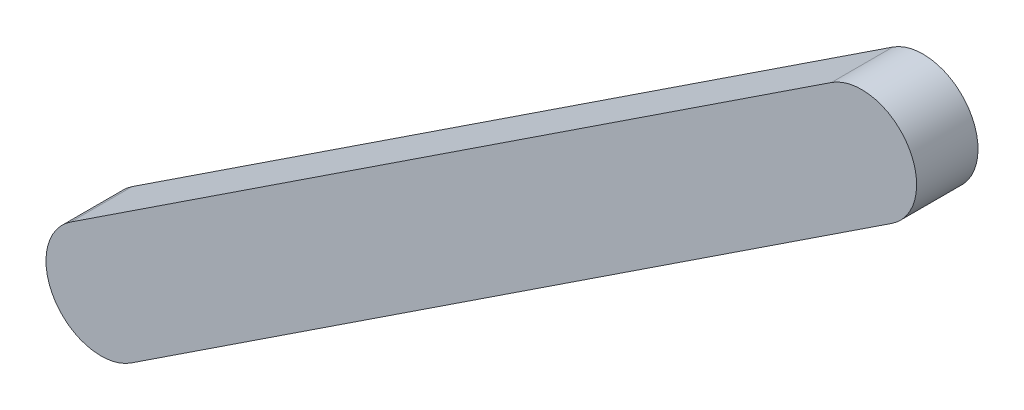
ISO-10303-21;
HEADER;
FILE_DESCRIPTION(('STEP AP214'),'2;1');
FILE_NAME('part.step','',(''),(''),'','','');
FILE_SCHEMA(('AUTOMOTIVE_DESIGN { 1 0 10303 214 1 1 1 1 }'));
ENDSEC;
DATA;
#1=APPLICATION_CONTEXT('core data for automotive mechanical design processes');
#2=APPLICATION_PROTOCOL_DEFINITION('international standard','automotive_design',2000,#1);
#3=PRODUCT_CONTEXT('',#1,'mechanical');
#4=PRODUCT('Part','Part','',(#3));
#5=PRODUCT_RELATED_PRODUCT_CATEGORY('part','',(#4));
#6=PRODUCT_DEFINITION_FORMATION('','',#4);
#7=PRODUCT_DEFINITION_CONTEXT('part definition',#1,'design');
#8=PRODUCT_DEFINITION('design','',#6,#7);
#9=PRODUCT_DEFINITION_SHAPE('','',#8);
#10=(LENGTH_UNIT() NAMED_UNIT(*) SI_UNIT(.MILLI.,.METRE.));
#11=(NAMED_UNIT(*) PLANE_ANGLE_UNIT() SI_UNIT($,.RADIAN.));
#12=(NAMED_UNIT(*) SI_UNIT($,.STERADIAN.) SOLID_ANGLE_UNIT());
#13=UNCERTAINTY_MEASURE_WITH_UNIT(LENGTH_MEASURE(1.E-05),#10,'distance_accuracy_value','');
#14=(GEOMETRIC_REPRESENTATION_CONTEXT(3) GLOBAL_UNCERTAINTY_ASSIGNED_CONTEXT((#13)) GLOBAL_UNIT_ASSIGNED_CONTEXT((#10,
#11,#12)) REPRESENTATION_CONTEXT('',''));
#15=CARTESIAN_POINT('',(0.,0.,0.));
#16=DIRECTION('',(0.,0.,1.));
#17=DIRECTION('',(1.,0.,0.));
#18=AXIS2_PLACEMENT_3D('',#15,#16,#17);
#19=CARTESIAN_POINT('',(-101.536460123151,225.704899979033,17.018));
#20=DIRECTION('',(0.,0.,-1.));
#21=DIRECTION('',(-1.,0.,0.));
#22=AXIS2_PLACEMENT_3D('',#19,#20,#21);
#23=CYLINDRICAL_SURFACE('',#22,15.24);
#24=CARTESIAN_POINT('',(-101.536460123151,225.704899979033,0.));
#25=DIRECTION('',(0.,0.,1.));
#26=DIRECTION('',(1.,0.,0.));
#27=AXIS2_PLACEMENT_3D('',#24,#25,#26);
#28=CIRCLE('',#27,15.24);
#29=CARTESIAN_POINT('',(-109.921184028861,238.43101505886,0.));
#30=VERTEX_POINT('',#29);
#31=CARTESIAN_POINT('',(-93.1517362174414,212.978784899205,0.));
#32=VERTEX_POINT('',#31);
#33=EDGE_CURVE('E106',#30,#32,#28,.T.);
#34=ORIENTED_EDGE('',*,*,#33,.T.);
#35=DIRECTION('',(0.,0.,-1.));
#36=VECTOR('',#35,1.);
#37=CARTESIAN_POINT('',(-93.1517362174414,212.978784899205,17.018));
#38=LINE('',#37,#36);
#39=CARTESIAN_POINT('',(-93.1517362174414,212.978784899205,17.018));
#40=VERTEX_POINT('',#39);
#41=EDGE_CURVE('E11',#40,#32,#38,.T.);
#42=ORIENTED_EDGE('',*,*,#41,.F.);
#43=CARTESIAN_POINT('',(-101.536460123151,225.704899979033,17.018));
#44=DIRECTION('',(0.,0.,1.));
#45=DIRECTION('',(1.,0.,0.));
#46=AXIS2_PLACEMENT_3D('',#43,#44,#45);
#47=CIRCLE('',#46,15.24);
#48=CARTESIAN_POINT('',(-109.921184028861,238.43101505886,17.018));
#49=VERTEX_POINT('',#48);
#50=EDGE_CURVE('E94',#49,#40,#47,.T.);
#51=ORIENTED_EDGE('',*,*,#50,.F.);
#52=DIRECTION('',(0.,0.,-1.));
#53=VECTOR('',#52,1.);
#54=CARTESIAN_POINT('',(-109.921184028861,238.43101505886,17.018));
#55=LINE('',#54,#53);
#56=EDGE_CURVE('E102',#49,#30,#55,.T.);
#57=ORIENTED_EDGE('',*,*,#56,.T.);
#58=EDGE_LOOP('',(#34,#42,#51,#57));
#59=FACE_BOUND('',#58,.T.);
#60=ADVANCED_FACE('F43',(#59),#23,.T.);
#61=CARTESIAN_POINT('',(-93.1517362174414,212.978784899205,17.018));
#62=DIRECTION('',(-0.550178733970445,0.835046921248547,0.));
#63=DIRECTION('',(-0.835046921248548,-0.550178733970445,0.));
#64=AXIS2_PLACEMENT_3D('',#61,#62,#63);
#65=PLANE('',#64);
#66=DIRECTION('',(0.835046921248548,0.550178733970445,0.));
#67=VECTOR('',#66,1.);
#68=CARTESIAN_POINT('',(-93.1517362174414,212.978784899205,0.));
#69=LINE('',#68,#67);
#70=CARTESIAN_POINT('',(117.750632913348,351.933848964651,0.));
#71=VERTEX_POINT('',#70);
#72=EDGE_CURVE('E98',#32,#71,#69,.T.);
#73=ORIENTED_EDGE('',*,*,#72,.T.);
#74=DIRECTION('',(0.,0.,-1.));
#75=VECTOR('',#74,1.);
#76=CARTESIAN_POINT('',(117.750632913348,351.933848964651,17.018));
#77=LINE('',#76,#75);
#78=CARTESIAN_POINT('',(117.750632913348,351.933848964651,17.018));
#79=VERTEX_POINT('',#78);
#80=EDGE_CURVE('E51',#79,#71,#77,.T.);
#81=ORIENTED_EDGE('',*,*,#80,.F.);
#82=DIRECTION('',(0.835046921248548,0.550178733970445,0.));
#83=VECTOR('',#82,1.);
#84=CARTESIAN_POINT('',(-93.1517362174414,212.978784899205,17.018));
#85=LINE('',#84,#83);
#86=EDGE_CURVE('E89',#40,#79,#85,.T.);
#87=ORIENTED_EDGE('',*,*,#86,.F.);
#88=ORIENTED_EDGE('',*,*,#41,.T.);
#89=EDGE_LOOP('',(#73,#81,#87,#88));
#90=FACE_BOUND('',#89,.T.);
#91=ADVANCED_FACE('F97',(#90),#65,.F.);
#92=CARTESIAN_POINT('',(109.365909007639,364.659964044479,17.018));
#93=DIRECTION('',(0.,0.,-1.));
#94=DIRECTION('',(-1.,0.,0.));
#95=AXIS2_PLACEMENT_3D('',#92,#93,#94);
#96=CYLINDRICAL_SURFACE('',#95,15.24);
#97=CARTESIAN_POINT('',(109.365909007639,364.659964044479,0.));
#98=DIRECTION('',(0.,0.,1.));
#99=DIRECTION('',(1.,0.,0.));
#100=AXIS2_PLACEMENT_3D('',#97,#98,#99);
#101=CIRCLE('',#100,15.24);
#102=CARTESIAN_POINT('',(100.981185101929,377.386079124306,0.));
#103=VERTEX_POINT('',#102);
#104=EDGE_CURVE('E76',#71,#103,#101,.T.);
#105=ORIENTED_EDGE('',*,*,#104,.T.);
#106=DIRECTION('',(0.,0.,-1.));
#107=VECTOR('',#106,1.);
#108=CARTESIAN_POINT('',(100.981185101929,377.386079124306,17.018));
#109=LINE('',#108,#107);
#110=CARTESIAN_POINT('',(100.981185101929,377.386079124306,17.018));
#111=VERTEX_POINT('',#110);
#112=EDGE_CURVE('E99',#111,#103,#109,.T.);
#113=ORIENTED_EDGE('',*,*,#112,.F.);
#114=CARTESIAN_POINT('',(109.365909007639,364.659964044479,17.018));
#115=DIRECTION('',(0.,0.,1.));
#116=DIRECTION('',(1.,0.,0.));
#117=AXIS2_PLACEMENT_3D('',#114,#115,#116);
#118=CIRCLE('',#117,15.24);
#119=EDGE_CURVE('E92',#79,#111,#118,.T.);
#120=ORIENTED_EDGE('',*,*,#119,.F.);
#121=ORIENTED_EDGE('',*,*,#80,.T.);
#122=EDGE_LOOP('',(#105,#113,#120,#121));
#123=FACE_BOUND('',#122,.T.);
#124=ADVANCED_FACE('F100',(#123),#96,.T.);
#125=CARTESIAN_POINT('',(-109.921184028861,238.43101505886,17.018));
#126=DIRECTION('',(0.550178733970445,-0.835046921248548,0.));
#127=DIRECTION('',(0.835046921248548,0.550178733970445,0.));
#128=AXIS2_PLACEMENT_3D('',#125,#126,#127);
#129=PLANE('',#128);
#130=DIRECTION('',(-0.835046921248548,-0.550178733970445,0.));
#131=VECTOR('',#130,1.);
#132=CARTESIAN_POINT('',(-109.921184028861,238.43101505886,0.));
#133=LINE('',#132,#131);
#134=EDGE_CURVE('E82',#103,#30,#133,.T.);
#135=ORIENTED_EDGE('',*,*,#134,.T.);
#136=ORIENTED_EDGE('',*,*,#56,.F.);
#137=DIRECTION('',(-0.835046921248548,-0.550178733970445,0.));
#138=VECTOR('',#137,1.);
#139=CARTESIAN_POINT('',(-109.921184028861,238.43101505886,17.018));
#140=LINE('',#139,#138);
#141=EDGE_CURVE('E59',#111,#49,#140,.T.);
#142=ORIENTED_EDGE('',*,*,#141,.F.);
#143=ORIENTED_EDGE('',*,*,#112,.T.);
#144=EDGE_LOOP('',(#135,#136,#142,#143));
#145=FACE_BOUND('',#144,.T.);
#146=ADVANCED_FACE('F113',(#145),#129,.F.);
#147=CARTESIAN_POINT('',(-101.536460123151,225.704899979033,17.018));
#148=DIRECTION('',(0.,0.,1.));
#149=DIRECTION('',(1.,0.,0.));
#150=AXIS2_PLACEMENT_3D('',#147,#148,#149);
#151=PLANE('',#150);
#152=ORIENTED_EDGE('',*,*,#50,.T.);
#153=ORIENTED_EDGE('',*,*,#86,.T.);
#154=ORIENTED_EDGE('',*,*,#119,.T.);
#155=ORIENTED_EDGE('',*,*,#141,.T.);
#156=EDGE_LOOP('',(#152,#153,#154,#155));
#157=FACE_BOUND('',#156,.T.);
#158=ADVANCED_FACE('F90',(#157),#151,.T.);
#159=CARTESIAN_POINT('',(-101.536460123151,225.704899979033,0.));
#160=DIRECTION('',(0.,0.,1.));
#161=DIRECTION('',(1.,0.,0.));
#162=AXIS2_PLACEMENT_3D('',#159,#160,#161);
#163=PLANE('',#162);
#164=ORIENTED_EDGE('',*,*,#33,.F.);
#165=ORIENTED_EDGE('',*,*,#134,.F.);
#166=ORIENTED_EDGE('',*,*,#104,.F.);
#167=ORIENTED_EDGE('',*,*,#72,.F.);
#168=EDGE_LOOP('',(#164,#165,#166,#167));
#169=FACE_BOUND('',#168,.T.);
#170=ADVANCED_FACE('F116',(#169),#163,.F.);
#171=CLOSED_SHELL('',(#60,#91,#124,#146,#158,#170));
#172=MANIFOLD_SOLID_BREP('B2',#171);
#173=ADVANCED_BREP_SHAPE_REPRESENTATION('',(#18,#172),#14);
#174=SHAPE_DEFINITION_REPRESENTATION(#9,#173);
ENDSEC;
END-ISO-10303-21;
